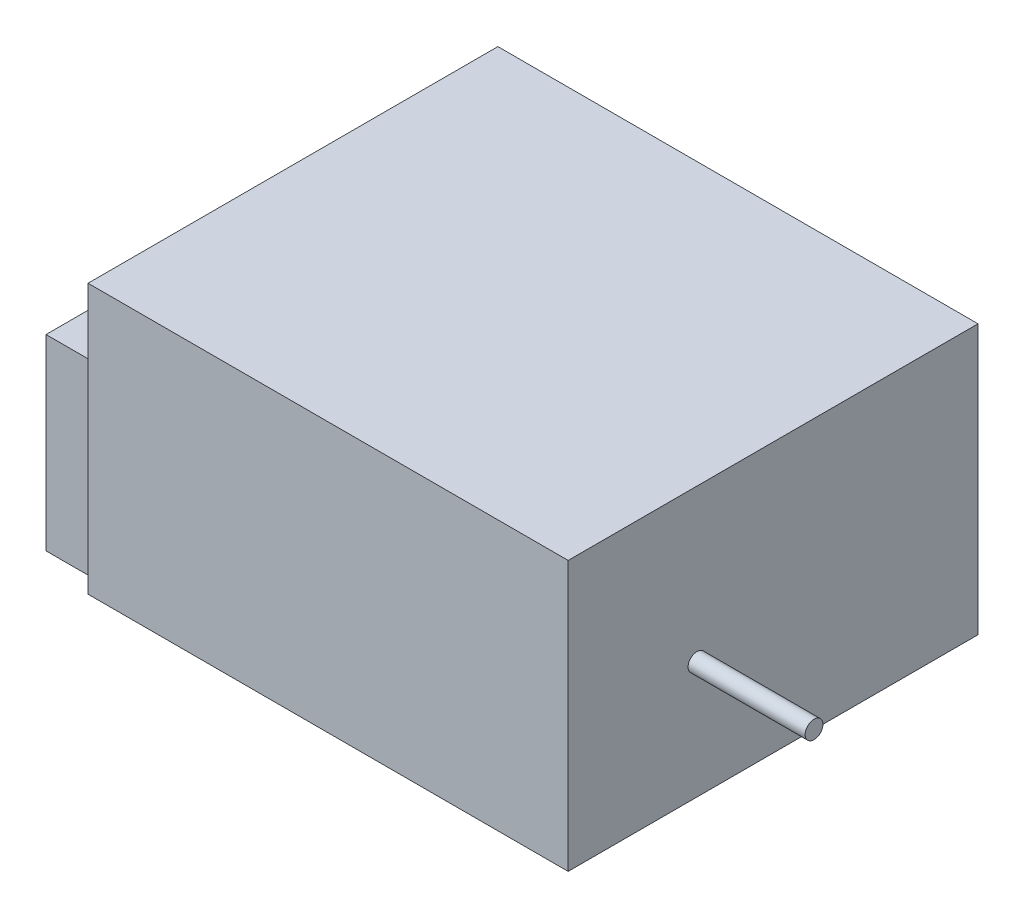
ISO-10303-21;
HEADER;
FILE_DESCRIPTION(('STEP AP214'),'2;1');
FILE_NAME('part.step','',(''),(''),'','','');
FILE_SCHEMA(('AUTOMOTIVE_DESIGN { 1 0 10303 214 1 1 1 1 }'));
ENDSEC;
DATA;
#1=APPLICATION_CONTEXT('core data for automotive mechanical design processes');
#2=APPLICATION_PROTOCOL_DEFINITION('international standard','automotive_design',2000,#1);
#3=PRODUCT_CONTEXT('',#1,'mechanical');
#4=PRODUCT('Part','Part','',(#3));
#5=PRODUCT_RELATED_PRODUCT_CATEGORY('part','',(#4));
#6=PRODUCT_DEFINITION_FORMATION('','',#4);
#7=PRODUCT_DEFINITION_CONTEXT('part definition',#1,'design');
#8=PRODUCT_DEFINITION('design','',#6,#7);
#9=PRODUCT_DEFINITION_SHAPE('','',#8);
#10=(LENGTH_UNIT() NAMED_UNIT(*) SI_UNIT(.MILLI.,.METRE.));
#11=(NAMED_UNIT(*) PLANE_ANGLE_UNIT() SI_UNIT($,.RADIAN.));
#12=(NAMED_UNIT(*) SI_UNIT($,.STERADIAN.) SOLID_ANGLE_UNIT());
#13=UNCERTAINTY_MEASURE_WITH_UNIT(LENGTH_MEASURE(1.E-05),#10,'distance_accuracy_value','');
#14=(GEOMETRIC_REPRESENTATION_CONTEXT(3) GLOBAL_UNCERTAINTY_ASSIGNED_CONTEXT((#13)) GLOBAL_UNIT_ASSIGNED_CONTEXT((#10,
#11,#12)) REPRESENTATION_CONTEXT('',''));
#15=CARTESIAN_POINT('',(0.,0.,0.));
#16=DIRECTION('',(0.,0.,1.));
#17=DIRECTION('',(1.,0.,0.));
#18=AXIS2_PLACEMENT_3D('',#15,#16,#17);
#19=CARTESIAN_POINT('',(-52.07,58.42,-44.45));
#20=DIRECTION('',(1.,0.,0.));
#21=DIRECTION('',(0.,0.,-1.));
#22=AXIS2_PLACEMENT_3D('',#19,#20,#21);
#23=PLANE('',#22);
#24=CARTESIAN_POINT('',(-52.07,25.4,-39.37));
#25=DIRECTION('',(1.,0.,0.));
#26=DIRECTION('',(0.,0.,-1.));
#27=AXIS2_PLACEMENT_3D('',#24,#25,#26);
#28=CIRCLE('',#27,2.68206620361274);
#29=CARTESIAN_POINT('',(-52.07,25.4,-42.0520662036127));
#30=VERTEX_POINT('',#29);
#31=EDGE_CURVE('E11',#30,#30,#28,.F.);
#32=ORIENTED_EDGE('',*,*,#31,.F.);
#33=EDGE_LOOP('',(#32));
#34=FACE_BOUND('',#33,.T.);
#35=DIRECTION('',(0.,-1.,0.));
#36=VECTOR('',#35,1.);
#37=CARTESIAN_POINT('',(-52.07,0.,0.224561746333612));
#38=LINE('',#37,#36);
#39=CARTESIAN_POINT('',(-52.07,40.64,0.224561746333612));
#40=VERTEX_POINT('',#39);
#41=CARTESIAN_POINT('',(-52.07,0.,0.224561746333611));
#42=VERTEX_POINT('',#41);
#43=EDGE_CURVE('E53',#40,#42,#38,.T.);
#44=ORIENTED_EDGE('',*,*,#43,.F.);
#45=DIRECTION('',(0.,0.,-1.));
#46=VECTOR('',#45,1.);
#47=CARTESIAN_POINT('',(-52.07,40.64,0.224561746333612));
#48=LINE('',#47,#46);
#49=CARTESIAN_POINT('',(-52.07,40.64,40.8645617463336));
#50=VERTEX_POINT('',#49);
#51=EDGE_CURVE('E122',#50,#40,#48,.T.);
#52=ORIENTED_EDGE('',*,*,#51,.F.);
#53=DIRECTION('',(0.,1.,0.));
#54=VECTOR('',#53,1.);
#55=CARTESIAN_POINT('',(-52.07,0.,40.8645617463336));
#56=LINE('',#55,#54);
#57=CARTESIAN_POINT('',(-52.07,0.,40.8645617463336));
#58=VERTEX_POINT('',#57);
#59=EDGE_CURVE('E59',#58,#50,#56,.T.);
#60=ORIENTED_EDGE('',*,*,#59,.F.);
#61=DIRECTION('',(0.,0.,1.));
#62=VECTOR('',#61,1.);
#63=CARTESIAN_POINT('',(-52.07,0.,-44.45));
#64=LINE('',#63,#62);
#65=CARTESIAN_POINT('',(-52.07,0.,44.45));
#66=VERTEX_POINT('',#65);
#67=EDGE_CURVE('E125',#58,#66,#64,.T.);
#68=ORIENTED_EDGE('',*,*,#67,.T.);
#69=DIRECTION('',(0.,-1.,0.));
#70=VECTOR('',#69,1.);
#71=CARTESIAN_POINT('',(-52.07,58.42,44.45));
#72=LINE('',#71,#70);
#73=CARTESIAN_POINT('',(-52.07,58.42,44.45));
#74=VERTEX_POINT('',#73);
#75=EDGE_CURVE('E157',#74,#66,#72,.T.);
#76=ORIENTED_EDGE('',*,*,#75,.F.);
#77=DIRECTION('',(0.,0.,1.));
#78=VECTOR('',#77,1.);
#79=CARTESIAN_POINT('',(-52.07,58.42,-44.45));
#80=LINE('',#79,#78);
#81=CARTESIAN_POINT('',(-52.07,58.42,-44.45));
#82=VERTEX_POINT('',#81);
#83=EDGE_CURVE('E133',#82,#74,#80,.T.);
#84=ORIENTED_EDGE('',*,*,#83,.F.);
#85=DIRECTION('',(0.,-1.,0.));
#86=VECTOR('',#85,1.);
#87=CARTESIAN_POINT('',(-52.07,58.42,-44.45));
#88=LINE('',#87,#86);
#89=CARTESIAN_POINT('',(-52.07,0.,-44.45));
#90=VERTEX_POINT('',#89);
#91=EDGE_CURVE('E142',#82,#90,#88,.T.);
#92=ORIENTED_EDGE('',*,*,#91,.T.);
#93=EDGE_CURVE('E127',#90,#42,#64,.T.);
#94=ORIENTED_EDGE('',*,*,#93,.T.);
#95=EDGE_LOOP('',(#44,#52,#60,#68,#76,#84,#92,#94));
#96=FACE_BOUND('',#95,.T.);
#97=ADVANCED_FACE('F39',(#34,#96),#23,.F.);
#98=CARTESIAN_POINT('',(-52.07,58.42,44.45));
#99=DIRECTION('',(0.,0.,-1.));
#100=DIRECTION('',(-1.,0.,0.));
#101=AXIS2_PLACEMENT_3D('',#98,#99,#100);
#102=PLANE('',#101);
#103=DIRECTION('',(1.,0.,0.));
#104=VECTOR('',#103,1.);
#105=CARTESIAN_POINT('',(-52.07,0.,44.45));
#106=LINE('',#105,#104);
#107=CARTESIAN_POINT('',(52.07,0.,44.45));
#108=VERTEX_POINT('',#107);
#109=EDGE_CURVE('E144',#66,#108,#106,.T.);
#110=ORIENTED_EDGE('',*,*,#109,.T.);
#111=DIRECTION('',(0.,-1.,0.));
#112=VECTOR('',#111,1.);
#113=CARTESIAN_POINT('',(52.07,58.42,44.45));
#114=LINE('',#113,#112);
#115=CARTESIAN_POINT('',(52.07,58.42,44.45));
#116=VERTEX_POINT('',#115);
#117=EDGE_CURVE('E154',#116,#108,#114,.T.);
#118=ORIENTED_EDGE('',*,*,#117,.F.);
#119=DIRECTION('',(1.,0.,0.));
#120=VECTOR('',#119,1.);
#121=CARTESIAN_POINT('',(-52.07,58.42,44.45));
#122=LINE('',#121,#120);
#123=EDGE_CURVE('E136',#74,#116,#122,.T.);
#124=ORIENTED_EDGE('',*,*,#123,.F.);
#125=ORIENTED_EDGE('',*,*,#75,.T.);
#126=EDGE_LOOP('',(#110,#118,#124,#125));
#127=FACE_BOUND('',#126,.T.);
#128=ADVANCED_FACE('F168',(#127),#102,.F.);
#129=CARTESIAN_POINT('',(52.07,58.42,-44.45));
#130=DIRECTION('',(-1.,0.,0.));
#131=DIRECTION('',(0.,0.,1.));
#132=AXIS2_PLACEMENT_3D('',#129,#130,#131);
#133=PLANE('',#132);
#134=CARTESIAN_POINT('',(52.07,25.4,16.51));
#135=DIRECTION('',(-1.,0.,0.));
#136=DIRECTION('',(0.,0.,1.));
#137=AXIS2_PLACEMENT_3D('',#134,#135,#136);
#138=CIRCLE('',#137,1.92746499864783);
#139=CARTESIAN_POINT('',(52.07,25.4,18.4374649986478));
#140=VERTEX_POINT('',#139);
#141=EDGE_CURVE('E46',#140,#140,#138,.F.);
#142=ORIENTED_EDGE('',*,*,#141,.F.);
#143=EDGE_LOOP('',(#142));
#144=FACE_BOUND('',#143,.T.);
#145=DIRECTION('',(0.,0.,-1.));
#146=VECTOR('',#145,1.);
#147=CARTESIAN_POINT('',(52.07,0.,-44.45));
#148=LINE('',#147,#146);
#149=CARTESIAN_POINT('',(52.07,0.,-44.45));
#150=VERTEX_POINT('',#149);
#151=EDGE_CURVE('E146',#108,#150,#148,.T.);
#152=ORIENTED_EDGE('',*,*,#151,.T.);
#153=DIRECTION('',(0.,-1.,0.));
#154=VECTOR('',#153,1.);
#155=CARTESIAN_POINT('',(52.07,58.42,-44.45));
#156=LINE('',#155,#154);
#157=CARTESIAN_POINT('',(52.07,58.42,-44.45));
#158=VERTEX_POINT('',#157);
#159=EDGE_CURVE('E151',#158,#150,#156,.T.);
#160=ORIENTED_EDGE('',*,*,#159,.F.);
#161=DIRECTION('',(0.,0.,-1.));
#162=VECTOR('',#161,1.);
#163=CARTESIAN_POINT('',(52.07,58.42,-44.45));
#164=LINE('',#163,#162);
#165=EDGE_CURVE('E139',#116,#158,#164,.T.);
#166=ORIENTED_EDGE('',*,*,#165,.F.);
#167=ORIENTED_EDGE('',*,*,#117,.T.);
#168=EDGE_LOOP('',(#152,#160,#166,#167));
#169=FACE_BOUND('',#168,.T.);
#170=ADVANCED_FACE('F164',(#144,#169),#133,.F.);
#171=CARTESIAN_POINT('',(-52.07,58.42,-44.45));
#172=DIRECTION('',(0.,0.,1.));
#173=DIRECTION('',(1.,0.,0.));
#174=AXIS2_PLACEMENT_3D('',#171,#172,#173);
#175=PLANE('',#174);
#176=DIRECTION('',(-1.,0.,0.));
#177=VECTOR('',#176,1.);
#178=CARTESIAN_POINT('',(-52.07,0.,-44.45));
#179=LINE('',#178,#177);
#180=EDGE_CURVE('E137',#150,#90,#179,.T.);
#181=ORIENTED_EDGE('',*,*,#180,.T.);
#182=ORIENTED_EDGE('',*,*,#91,.F.);
#183=DIRECTION('',(-1.,0.,0.));
#184=VECTOR('',#183,1.);
#185=CARTESIAN_POINT('',(-52.07,58.42,-44.45));
#186=LINE('',#185,#184);
#187=EDGE_CURVE('E141',#158,#82,#186,.T.);
#188=ORIENTED_EDGE('',*,*,#187,.F.);
#189=ORIENTED_EDGE('',*,*,#159,.T.);
#190=EDGE_LOOP('',(#181,#182,#188,#189));
#191=FACE_BOUND('',#190,.T.);
#192=ADVANCED_FACE('F167',(#191),#175,.F.);
#193=CARTESIAN_POINT('',(0.,58.42,0.));
#194=DIRECTION('',(0.,1.,0.));
#195=DIRECTION('',(0.,0.,1.));
#196=AXIS2_PLACEMENT_3D('',#193,#194,#195);
#197=PLANE('',#196);
#198=ORIENTED_EDGE('',*,*,#83,.T.);
#199=ORIENTED_EDGE('',*,*,#123,.T.);
#200=ORIENTED_EDGE('',*,*,#165,.T.);
#201=ORIENTED_EDGE('',*,*,#187,.T.);
#202=EDGE_LOOP('',(#198,#199,#200,#201));
#203=FACE_BOUND('',#202,.T.);
#204=ADVANCED_FACE('F182',(#203),#197,.T.);
#205=CARTESIAN_POINT('',(0.,0.,0.));
#206=DIRECTION('',(0.,1.,0.));
#207=DIRECTION('',(0.,0.,1.));
#208=AXIS2_PLACEMENT_3D('',#205,#206,#207);
#209=PLANE('',#208);
#210=ORIENTED_EDGE('',*,*,#93,.F.);
#211=ORIENTED_EDGE('',*,*,#180,.F.);
#212=ORIENTED_EDGE('',*,*,#151,.F.);
#213=ORIENTED_EDGE('',*,*,#109,.F.);
#214=ORIENTED_EDGE('',*,*,#67,.F.);
#215=DIRECTION('',(1.,0.,0.));
#216=VECTOR('',#215,1.);
#217=CARTESIAN_POINT('',(-64.77,0.,40.8645617463336));
#218=LINE('',#217,#216);
#219=CARTESIAN_POINT('',(-64.77,0.,40.8645617463336));
#220=VERTEX_POINT('',#219);
#221=EDGE_CURVE('E109',#220,#58,#218,.T.);
#222=ORIENTED_EDGE('',*,*,#221,.F.);
#223=DIRECTION('',(0.,0.,1.));
#224=VECTOR('',#223,1.);
#225=CARTESIAN_POINT('',(-64.77,0.,0.224561746333614));
#226=LINE('',#225,#224);
#227=CARTESIAN_POINT('',(-64.77,0.,0.224561746333614));
#228=VERTEX_POINT('',#227);
#229=EDGE_CURVE('E102',#228,#220,#226,.T.);
#230=ORIENTED_EDGE('',*,*,#229,.F.);
#231=DIRECTION('',(1.,0.,0.));
#232=VECTOR('',#231,1.);
#233=CARTESIAN_POINT('',(-64.77,0.,0.224561746333614));
#234=LINE('',#233,#232);
#235=EDGE_CURVE('E107',#228,#42,#234,.T.);
#236=ORIENTED_EDGE('',*,*,#235,.T.);
#237=EDGE_LOOP('',(#210,#211,#212,#213,#214,#222,#230,#236));
#238=FACE_BOUND('',#237,.T.);
#239=ADVANCED_FACE('F105',(#238),#209,.F.);
#240=CARTESIAN_POINT('',(-64.77,0.,0.224561746333614));
#241=DIRECTION('',(0.,0.,1.));
#242=DIRECTION('',(1.,0.,0.));
#243=AXIS2_PLACEMENT_3D('',#240,#241,#242);
#244=PLANE('',#243);
#245=ORIENTED_EDGE('',*,*,#43,.T.);
#246=ORIENTED_EDGE('',*,*,#235,.F.);
#247=DIRECTION('',(0.,-1.,0.));
#248=VECTOR('',#247,1.);
#249=CARTESIAN_POINT('',(-64.77,0.,0.224561746333614));
#250=LINE('',#249,#248);
#251=CARTESIAN_POINT('',(-64.77,40.64,0.224561746333614));
#252=VERTEX_POINT('',#251);
#253=EDGE_CURVE('E113',#252,#228,#250,.T.);
#254=ORIENTED_EDGE('',*,*,#253,.F.);
#255=DIRECTION('',(1.,0.,0.));
#256=VECTOR('',#255,1.);
#257=CARTESIAN_POINT('',(-64.77,40.64,0.224561746333614));
#258=LINE('',#257,#256);
#259=EDGE_CURVE('E189',#252,#40,#258,.T.);
#260=ORIENTED_EDGE('',*,*,#259,.T.);
#261=EDGE_LOOP('',(#245,#246,#254,#260));
#262=FACE_BOUND('',#261,.T.);
#263=ADVANCED_FACE('F124',(#262),#244,.F.);
#264=CARTESIAN_POINT('',(-64.77,0.,40.8645617463336));
#265=DIRECTION('',(0.,0.,-1.));
#266=DIRECTION('',(-1.,0.,0.));
#267=AXIS2_PLACEMENT_3D('',#264,#265,#266);
#268=PLANE('',#267);
#269=ORIENTED_EDGE('',*,*,#59,.T.);
#270=DIRECTION('',(1.,0.,0.));
#271=VECTOR('',#270,1.);
#272=CARTESIAN_POINT('',(-64.77,40.64,40.8645617463336));
#273=LINE('',#272,#271);
#274=CARTESIAN_POINT('',(-64.77,40.64,40.8645617463336));
#275=VERTEX_POINT('',#274);
#276=EDGE_CURVE('E129',#275,#50,#273,.T.);
#277=ORIENTED_EDGE('',*,*,#276,.F.);
#278=DIRECTION('',(0.,1.,0.));
#279=VECTOR('',#278,1.);
#280=CARTESIAN_POINT('',(-64.77,0.,40.8645617463336));
#281=LINE('',#280,#279);
#282=EDGE_CURVE('E112',#220,#275,#281,.T.);
#283=ORIENTED_EDGE('',*,*,#282,.F.);
#284=ORIENTED_EDGE('',*,*,#221,.T.);
#285=EDGE_LOOP('',(#269,#277,#283,#284));
#286=FACE_BOUND('',#285,.T.);
#287=ADVANCED_FACE('F185',(#286),#268,.F.);
#288=CARTESIAN_POINT('',(-64.77,40.64,0.224561746333614));
#289=DIRECTION('',(0.,-1.,0.));
#290=DIRECTION('',(0.,0.,-1.));
#291=AXIS2_PLACEMENT_3D('',#288,#289,#290);
#292=PLANE('',#291);
#293=ORIENTED_EDGE('',*,*,#51,.T.);
#294=ORIENTED_EDGE('',*,*,#259,.F.);
#295=DIRECTION('',(0.,0.,-1.));
#296=VECTOR('',#295,1.);
#297=CARTESIAN_POINT('',(-64.77,40.64,0.224561746333614));
#298=LINE('',#297,#296);
#299=EDGE_CURVE('E118',#275,#252,#298,.T.);
#300=ORIENTED_EDGE('',*,*,#299,.F.);
#301=ORIENTED_EDGE('',*,*,#276,.T.);
#302=EDGE_LOOP('',(#293,#294,#300,#301));
#303=FACE_BOUND('',#302,.T.);
#304=ADVANCED_FACE('F197',(#303),#292,.F.);
#305=CARTESIAN_POINT('',(-64.77,0.,0.));
#306=DIRECTION('',(1.,0.,0.));
#307=DIRECTION('',(0.,0.,-1.));
#308=AXIS2_PLACEMENT_3D('',#305,#306,#307);
#309=PLANE('',#308);
#310=ORIENTED_EDGE('',*,*,#253,.T.);
#311=ORIENTED_EDGE('',*,*,#229,.T.);
#312=ORIENTED_EDGE('',*,*,#282,.T.);
#313=ORIENTED_EDGE('',*,*,#299,.T.);
#314=EDGE_LOOP('',(#310,#311,#312,#313));
#315=FACE_BOUND('',#314,.T.);
#316=ADVANCED_FACE('F116',(#315),#309,.F.);
#317=CARTESIAN_POINT('',(77.47,25.4,16.51));
#318=DIRECTION('',(-1.,0.,0.));
#319=DIRECTION('',(0.,0.,1.));
#320=AXIS2_PLACEMENT_3D('',#317,#318,#319);
#321=CYLINDRICAL_SURFACE('',#320,1.92746499864783);
#322=CARTESIAN_POINT('',(77.47,25.4,16.51));
#323=DIRECTION('',(1.,0.,0.));
#324=DIRECTION('',(0.,0.,-1.));
#325=AXIS2_PLACEMENT_3D('',#322,#323,#324);
#326=CIRCLE('',#325,1.92746499864783);
#327=CARTESIAN_POINT('',(77.47,25.4,14.5825350013522));
#328=VERTEX_POINT('',#327);
#329=EDGE_CURVE('E193',#328,#328,#326,.T.);
#330=ORIENTED_EDGE('',*,*,#329,.F.);
#331=EDGE_LOOP('',(#330));
#332=FACE_BOUND('',#331,.T.);
#333=ORIENTED_EDGE('',*,*,#141,.T.);
#334=EDGE_LOOP('',(#333));
#335=FACE_BOUND('',#334,.T.);
#336=ADVANCED_FACE('F162',(#332,#335),#321,.T.);
#337=CARTESIAN_POINT('',(77.47,25.4,16.51));
#338=DIRECTION('',(1.,0.,0.));
#339=DIRECTION('',(0.,0.,-1.));
#340=AXIS2_PLACEMENT_3D('',#337,#338,#339);
#341=PLANE('',#340);
#342=ORIENTED_EDGE('',*,*,#329,.T.);
#343=EDGE_LOOP('',(#342));
#344=FACE_BOUND('',#343,.T.);
#345=ADVANCED_FACE('F217',(#344),#341,.T.);
#346=CARTESIAN_POINT('',(-77.47,25.4,-39.37));
#347=DIRECTION('',(1.,0.,0.));
#348=DIRECTION('',(0.,0.,-1.));
#349=AXIS2_PLACEMENT_3D('',#346,#347,#348);
#350=CYLINDRICAL_SURFACE('',#349,2.68206620361274);
#351=CARTESIAN_POINT('',(-77.47,25.4,-39.37));
#352=DIRECTION('',(-1.,0.,0.));
#353=DIRECTION('',(0.,0.,1.));
#354=AXIS2_PLACEMENT_3D('',#351,#352,#353);
#355=CIRCLE('',#354,2.68206620361274);
#356=CARTESIAN_POINT('',(-77.47,25.4,-36.6879337963873));
#357=VERTEX_POINT('',#356);
#358=EDGE_CURVE('E235',#357,#357,#355,.T.);
#359=ORIENTED_EDGE('',*,*,#358,.F.);
#360=EDGE_LOOP('',(#359));
#361=FACE_BOUND('',#360,.T.);
#362=ORIENTED_EDGE('',*,*,#31,.T.);
#363=EDGE_LOOP('',(#362));
#364=FACE_BOUND('',#363,.T.);
#365=ADVANCED_FACE('F215',(#361,#364),#350,.T.);
#366=CARTESIAN_POINT('',(-77.47,25.4,-39.37));
#367=DIRECTION('',(-1.,0.,0.));
#368=DIRECTION('',(0.,0.,1.));
#369=AXIS2_PLACEMENT_3D('',#366,#367,#368);
#370=PLANE('',#369);
#371=ORIENTED_EDGE('',*,*,#358,.T.);
#372=EDGE_LOOP('',(#371));
#373=FACE_BOUND('',#372,.T.);
#374=ADVANCED_FACE('F216',(#373),#370,.T.);
#375=CLOSED_SHELL('',(#97,#128,#170,#192,#204,#239,#263,#287,#304,#316,#336,#345,#365,#374));
#376=MANIFOLD_SOLID_BREP('B2',#375);
#377=ADVANCED_BREP_SHAPE_REPRESENTATION('',(#18,#376),#14);
#378=SHAPE_DEFINITION_REPRESENTATION(#9,#377);
ENDSEC;
END-ISO-10303-21;
